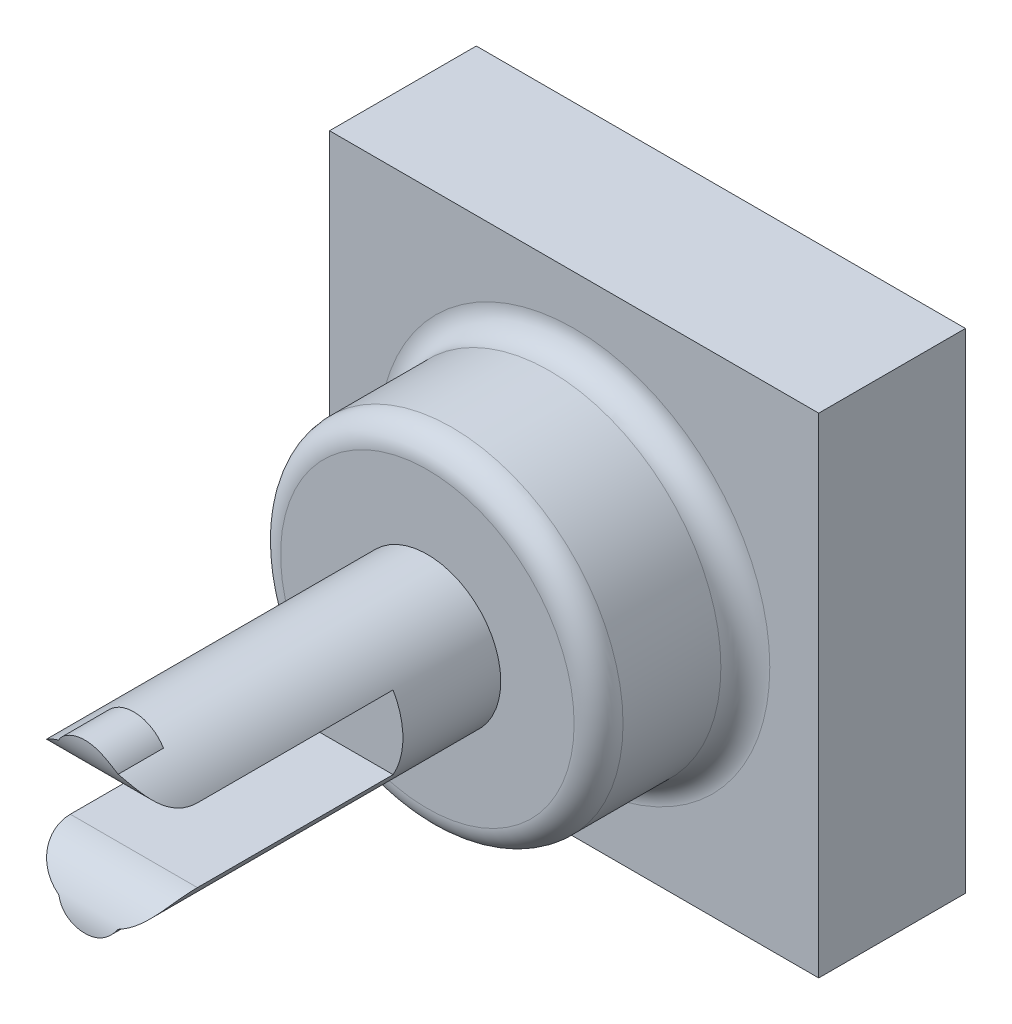
ISO-10303-21;
HEADER;
FILE_DESCRIPTION(('STEP AP214'),'2;1');
FILE_NAME('part.step','',(''),(''),'','','');
FILE_SCHEMA(('AUTOMOTIVE_DESIGN { 1 0 10303 214 1 1 1 1 }'));
ENDSEC;
DATA;
#1=APPLICATION_CONTEXT('core data for automotive mechanical design processes');
#2=APPLICATION_PROTOCOL_DEFINITION('international standard','automotive_design',2000,#1);
#3=PRODUCT_CONTEXT('',#1,'mechanical');
#4=PRODUCT('Part','Part','',(#3));
#5=PRODUCT_RELATED_PRODUCT_CATEGORY('part','',(#4));
#6=PRODUCT_DEFINITION_FORMATION('','',#4);
#7=PRODUCT_DEFINITION_CONTEXT('part definition',#1,'design');
#8=PRODUCT_DEFINITION('design','',#6,#7);
#9=PRODUCT_DEFINITION_SHAPE('','',#8);
#10=(LENGTH_UNIT() NAMED_UNIT(*) SI_UNIT(.MILLI.,.METRE.));
#11=(NAMED_UNIT(*) PLANE_ANGLE_UNIT() SI_UNIT($,.RADIAN.));
#12=(NAMED_UNIT(*) SI_UNIT($,.STERADIAN.) SOLID_ANGLE_UNIT());
#13=UNCERTAINTY_MEASURE_WITH_UNIT(LENGTH_MEASURE(1.E-05),#10,'distance_accuracy_value','');
#14=(GEOMETRIC_REPRESENTATION_CONTEXT(3) GLOBAL_UNCERTAINTY_ASSIGNED_CONTEXT((#13)) GLOBAL_UNIT_ASSIGNED_CONTEXT((#10,
#11,#12)) REPRESENTATION_CONTEXT('',''));
#15=CARTESIAN_POINT('',(0.,0.,0.));
#16=DIRECTION('',(0.,0.,1.));
#17=DIRECTION('',(1.,0.,0.));
#18=AXIS2_PLACEMENT_3D('',#15,#16,#17);
#19=CARTESIAN_POINT('',(5.,-5.,3.));
#20=DIRECTION('',(-1.,0.,0.));
#21=DIRECTION('',(0.,0.,1.));
#22=AXIS2_PLACEMENT_3D('',#19,#20,#21);
#23=PLANE('',#22);
#24=DIRECTION('',(0.,1.,0.));
#25=VECTOR('',#24,1.);
#26=CARTESIAN_POINT('',(5.,-5.,0.));
#27=LINE('',#26,#25);
#28=CARTESIAN_POINT('',(5.,-5.,0.));
#29=VERTEX_POINT('',#28);
#30=CARTESIAN_POINT('',(5.,5.,0.));
#31=VERTEX_POINT('',#30);
#32=EDGE_CURVE('E174',#29,#31,#27,.T.);
#33=ORIENTED_EDGE('',*,*,#32,.T.);
#34=DIRECTION('',(0.,0.,-1.));
#35=VECTOR('',#34,1.);
#36=CARTESIAN_POINT('',(5.,5.,3.));
#37=LINE('',#36,#35);
#38=CARTESIAN_POINT('',(5.,5.,3.));
#39=VERTEX_POINT('',#38);
#40=EDGE_CURVE('E201',#39,#31,#37,.T.);
#41=ORIENTED_EDGE('',*,*,#40,.F.);
#42=DIRECTION('',(0.,1.,0.));
#43=VECTOR('',#42,1.);
#44=CARTESIAN_POINT('',(5.,-5.,3.));
#45=LINE('',#44,#43);
#46=CARTESIAN_POINT('',(5.,-5.,3.));
#47=VERTEX_POINT('',#46);
#48=EDGE_CURVE('E175',#47,#39,#45,.T.);
#49=ORIENTED_EDGE('',*,*,#48,.F.);
#50=DIRECTION('',(0.,0.,-1.));
#51=VECTOR('',#50,1.);
#52=CARTESIAN_POINT('',(5.,-5.,3.));
#53=LINE('',#52,#51);
#54=EDGE_CURVE('E185',#47,#29,#53,.T.);
#55=ORIENTED_EDGE('',*,*,#54,.T.);
#56=EDGE_LOOP('',(#33,#41,#49,#55));
#57=FACE_BOUND('',#56,.T.);
#58=ADVANCED_FACE('F33',(#57),#23,.F.);
#59=CARTESIAN_POINT('',(-5.,5.,3.));
#60=DIRECTION('',(0.,-1.,0.));
#61=DIRECTION('',(0.,0.,-1.));
#62=AXIS2_PLACEMENT_3D('',#59,#60,#61);
#63=PLANE('',#62);
#64=DIRECTION('',(-1.,0.,0.));
#65=VECTOR('',#64,1.);
#66=CARTESIAN_POINT('',(-5.,5.,0.));
#67=LINE('',#66,#65);
#68=CARTESIAN_POINT('',(-5.,5.,0.));
#69=VERTEX_POINT('',#68);
#70=EDGE_CURVE('E188',#31,#69,#67,.T.);
#71=ORIENTED_EDGE('',*,*,#70,.T.);
#72=DIRECTION('',(0.,0.,-1.));
#73=VECTOR('',#72,1.);
#74=CARTESIAN_POINT('',(-5.,5.,3.));
#75=LINE('',#74,#73);
#76=CARTESIAN_POINT('',(-5.,5.,3.));
#77=VERTEX_POINT('',#76);
#78=EDGE_CURVE('E198',#77,#69,#75,.T.);
#79=ORIENTED_EDGE('',*,*,#78,.F.);
#80=DIRECTION('',(-1.,0.,0.));
#81=VECTOR('',#80,1.);
#82=CARTESIAN_POINT('',(-5.,5.,3.));
#83=LINE('',#82,#81);
#84=EDGE_CURVE('E178',#39,#77,#83,.T.);
#85=ORIENTED_EDGE('',*,*,#84,.F.);
#86=ORIENTED_EDGE('',*,*,#40,.T.);
#87=EDGE_LOOP('',(#71,#79,#85,#86));
#88=FACE_BOUND('',#87,.T.);
#89=ADVANCED_FACE('F279',(#88),#63,.F.);
#90=CARTESIAN_POINT('',(-5.,-5.,3.));
#91=DIRECTION('',(1.,0.,0.));
#92=DIRECTION('',(0.,0.,-1.));
#93=AXIS2_PLACEMENT_3D('',#90,#91,#92);
#94=PLANE('',#93);
#95=DIRECTION('',(0.,-1.,0.));
#96=VECTOR('',#95,1.);
#97=CARTESIAN_POINT('',(-5.,-5.,0.));
#98=LINE('',#97,#96);
#99=CARTESIAN_POINT('',(-5.,-5.,0.));
#100=VERTEX_POINT('',#99);
#101=EDGE_CURVE('E190',#69,#100,#98,.T.);
#102=ORIENTED_EDGE('',*,*,#101,.T.);
#103=DIRECTION('',(0.,0.,-1.));
#104=VECTOR('',#103,1.);
#105=CARTESIAN_POINT('',(-5.,-5.,3.));
#106=LINE('',#105,#104);
#107=CARTESIAN_POINT('',(-5.,-5.,3.));
#108=VERTEX_POINT('',#107);
#109=EDGE_CURVE('E195',#108,#100,#106,.T.);
#110=ORIENTED_EDGE('',*,*,#109,.F.);
#111=DIRECTION('',(0.,-1.,0.));
#112=VECTOR('',#111,1.);
#113=CARTESIAN_POINT('',(-5.,-5.,3.));
#114=LINE('',#113,#112);
#115=EDGE_CURVE('E181',#77,#108,#114,.T.);
#116=ORIENTED_EDGE('',*,*,#115,.F.);
#117=ORIENTED_EDGE('',*,*,#78,.T.);
#118=EDGE_LOOP('',(#102,#110,#116,#117));
#119=FACE_BOUND('',#118,.T.);
#120=ADVANCED_FACE('F284',(#119),#94,.F.);
#121=CARTESIAN_POINT('',(-5.,-5.,3.));
#122=DIRECTION('',(0.,1.,0.));
#123=DIRECTION('',(0.,0.,1.));
#124=AXIS2_PLACEMENT_3D('',#121,#122,#123);
#125=PLANE('',#124);
#126=DIRECTION('',(1.,0.,0.));
#127=VECTOR('',#126,1.);
#128=CARTESIAN_POINT('',(-5.,-5.,0.));
#129=LINE('',#128,#127);
#130=EDGE_CURVE('E179',#100,#29,#129,.T.);
#131=ORIENTED_EDGE('',*,*,#130,.T.);
#132=ORIENTED_EDGE('',*,*,#54,.F.);
#133=DIRECTION('',(1.,0.,0.));
#134=VECTOR('',#133,1.);
#135=CARTESIAN_POINT('',(-5.,-5.,3.));
#136=LINE('',#135,#134);
#137=EDGE_CURVE('E183',#108,#47,#136,.T.);
#138=ORIENTED_EDGE('',*,*,#137,.F.);
#139=ORIENTED_EDGE('',*,*,#109,.T.);
#140=EDGE_LOOP('',(#131,#132,#138,#139));
#141=FACE_BOUND('',#140,.T.);
#142=ADVANCED_FACE('F301',(#141),#125,.F.);
#143=CARTESIAN_POINT('',(0.,0.,3.));
#144=DIRECTION('',(0.,0.,-1.));
#145=DIRECTION('',(-1.,0.,0.));
#146=AXIS2_PLACEMENT_3D('',#143,#144,#145);
#147=PLANE('',#146);
#148=CARTESIAN_POINT('',(0.,0.,3.));
#149=DIRECTION('',(0.,0.,-1.));
#150=DIRECTION('',(-1.,0.,0.));
#151=AXIS2_PLACEMENT_3D('',#148,#149,#150);
#152=CIRCLE('',#151,4.);
#153=CARTESIAN_POINT('',(-4.,0.,3.));
#154=VERTEX_POINT('',#153);
#155=EDGE_CURVE('E41',#154,#154,#152,.T.);
#156=ORIENTED_EDGE('',*,*,#155,.T.);
#157=EDGE_LOOP('',(#156));
#158=FACE_BOUND('',#157,.T.);
#159=ORIENTED_EDGE('',*,*,#48,.T.);
#160=ORIENTED_EDGE('',*,*,#84,.T.);
#161=ORIENTED_EDGE('',*,*,#115,.T.);
#162=ORIENTED_EDGE('',*,*,#137,.T.);
#163=EDGE_LOOP('',(#159,#160,#161,#162));
#164=FACE_BOUND('',#163,.T.);
#165=ADVANCED_FACE('F297',(#158,#164),#147,.F.);
#166=CARTESIAN_POINT('',(0.,0.,0.));
#167=DIRECTION('',(0.,0.,-1.));
#168=DIRECTION('',(-1.,0.,0.));
#169=AXIS2_PLACEMENT_3D('',#166,#167,#168);
#170=PLANE('',#169);
#171=ORIENTED_EDGE('',*,*,#32,.F.);
#172=ORIENTED_EDGE('',*,*,#130,.F.);
#173=ORIENTED_EDGE('',*,*,#101,.F.);
#174=ORIENTED_EDGE('',*,*,#70,.F.);
#175=EDGE_LOOP('',(#171,#172,#173,#174));
#176=FACE_BOUND('',#175,.T.);
#177=ADVANCED_FACE('F292',(#176),#170,.T.);
#178=CARTESIAN_POINT('',(0.,0.,6.));
#179=DIRECTION('',(0.,0.,-1.));
#180=DIRECTION('',(-1.,0.,0.));
#181=AXIS2_PLACEMENT_3D('',#178,#179,#180);
#182=CYLINDRICAL_SURFACE('',#181,3.5);
#183=CARTESIAN_POINT('',(0.,0.,3.5));
#184=DIRECTION('',(0.,0.,-1.));
#185=DIRECTION('',(-1.,0.,0.));
#186=AXIS2_PLACEMENT_3D('',#183,#184,#185);
#187=CIRCLE('',#186,3.5);
#188=CARTESIAN_POINT('',(-3.5,0.,3.5));
#189=VERTEX_POINT('',#188);
#190=EDGE_CURVE('E324',#189,#189,#187,.F.);
#191=ORIENTED_EDGE('',*,*,#190,.T.);
#192=EDGE_LOOP('',(#191));
#193=FACE_BOUND('',#192,.T.);
#194=CARTESIAN_POINT('',(0.,0.,5.5));
#195=DIRECTION('',(0.,0.,1.));
#196=DIRECTION('',(1.,0.,0.));
#197=AXIS2_PLACEMENT_3D('',#194,#195,#196);
#198=CIRCLE('',#197,3.5);
#199=CARTESIAN_POINT('',(3.5,0.,5.5));
#200=VERTEX_POINT('',#199);
#201=EDGE_CURVE('E327',#200,#200,#198,.F.);
#202=ORIENTED_EDGE('',*,*,#201,.T.);
#203=EDGE_LOOP('',(#202));
#204=FACE_BOUND('',#203,.T.);
#205=ADVANCED_FACE('F312',(#193,#204),#182,.T.);
#206=CARTESIAN_POINT('',(0.,0.,6.));
#207=DIRECTION('',(0.,0.,1.));
#208=DIRECTION('',(1.,0.,0.));
#209=AXIS2_PLACEMENT_3D('',#206,#207,#208);
#210=PLANE('',#209);
#211=CARTESIAN_POINT('',(0.,0.,6.));
#212=DIRECTION('',(0.,0.,1.));
#213=DIRECTION('',(1.,0.,0.));
#214=AXIS2_PLACEMENT_3D('',#211,#212,#213);
#215=CIRCLE('',#214,3.);
#216=CARTESIAN_POINT('',(3.,0.,6.));
#217=VERTEX_POINT('',#216);
#218=EDGE_CURVE('E11',#217,#217,#215,.T.);
#219=ORIENTED_EDGE('',*,*,#218,.T.);
#220=EDGE_LOOP('',(#219));
#221=FACE_BOUND('',#220,.T.);
#222=CARTESIAN_POINT('',(0.,0.,6.));
#223=DIRECTION('',(0.,0.,1.));
#224=DIRECTION('',(1.,0.,0.));
#225=AXIS2_PLACEMENT_3D('',#222,#223,#224);
#226=CIRCLE('',#225,1.5);
#227=CARTESIAN_POINT('',(1.5,0.,6.));
#228=VERTEX_POINT('',#227);
#229=EDGE_CURVE('E171',#228,#228,#226,.T.);
#230=ORIENTED_EDGE('',*,*,#229,.F.);
#231=EDGE_LOOP('',(#230));
#232=FACE_BOUND('',#231,.T.);
#233=ADVANCED_FACE('F228',(#221,#232),#210,.T.);
#234=CARTESIAN_POINT('',(0.,0.,13.));
#235=DIRECTION('',(0.,0.,-1.));
#236=DIRECTION('',(-1.,0.,0.));
#237=AXIS2_PLACEMENT_3D('',#234,#235,#236);
#238=CYLINDRICAL_SURFACE('',#237,1.5);
#239=DIRECTION('',(0.,0.,-1.));
#240=VECTOR('',#239,1.);
#241=CARTESIAN_POINT('',(-1.29903810567666,0.75,13.));
#242=LINE('',#241,#240);
#243=CARTESIAN_POINT('',(-1.29903810567666,0.75,8.));
#244=VERTEX_POINT('',#243);
#245=CARTESIAN_POINT('',(-1.29903810567666,0.75,12.));
#246=VERTEX_POINT('',#245);
#247=EDGE_CURVE('E135',#244,#246,#242,.F.);
#248=ORIENTED_EDGE('',*,*,#247,.T.);
#249=CARTESIAN_POINT('',(-1.29903810567666,0.75,12.));
#250=CARTESIAN_POINT('',(-1.29903488796064,0.749998995664194,12.0241539240563));
#251=CARTESIAN_POINT('',(-1.29853286453121,0.750875868741205,12.0482965166914));
#252=CARTESIAN_POINT('',(-1.29650975747627,0.754366235091708,12.096413316051));
#253=CARTESIAN_POINT('',(-1.29498865171252,0.756979766091814,12.120387519106));
#254=CARTESIAN_POINT('',(-1.28886921008611,0.767388689671477,12.191783216743));
#255=CARTESIAN_POINT('',(-1.28271483737892,0.777752502095519,12.2387333870776));
#256=CARTESIAN_POINT('',(-1.26591452387574,0.804805039707058,12.3299619855437));
#257=CARTESIAN_POINT('',(-1.25526409092647,0.821500088928881,12.3742376908215));
#258=CARTESIAN_POINT('',(-1.22903712147644,0.860239334987382,12.4587860070871));
#259=CARTESIAN_POINT('',(-1.21346378030899,0.882280059929423,12.4990611924868));
#260=CARTESIAN_POINT('',(-1.17723309549798,0.930057831614213,12.5741567709373));
#261=CARTESIAN_POINT('',(-1.15663021002548,0.955754129407387,12.6090294523836));
#262=CARTESIAN_POINT('',(-1.11019990741427,1.0093110654543,12.6731464884562));
#263=CARTESIAN_POINT('',(-1.08437361289219,1.03717123785629,12.7023920498339));
#264=CARTESIAN_POINT('',(-1.02721530563586,1.09383621555043,12.7556409037523));
#265=CARTESIAN_POINT('',(-0.995784523058708,1.12264880644261,12.7795291029872));
#266=CARTESIAN_POINT('',(-0.928330513402187,1.17904216758258,12.8217377372788));
#267=CARTESIAN_POINT('',(-0.892298830568609,1.20662054021775,12.8400477051537));
#268=CARTESIAN_POINT('',(-0.816134552710509,1.25939963396201,12.8719352989423));
#269=CARTESIAN_POINT('',(-0.775972007599837,1.28458000831826,12.8854746784931));
#270=CARTESIAN_POINT('',(-0.713532454978741,1.31963687422097,12.9027492045215));
#271=CARTESIAN_POINT('',(-0.692393064696444,1.33085256723746,12.9079949363484));
#272=CARTESIAN_POINT('',(-0.649450607751044,1.35232755324812,12.9176023046443));
#273=CARTESIAN_POINT('',(-0.627647857194764,1.36258729259364,12.9219643548481));
#274=CARTESIAN_POINT('',(-0.605547236868077,1.37233834892181,12.9259436685376));
#275=B_SPLINE_CURVE_WITH_KNOTS('',3,(#249,#250,#251,#252,#253,#254,#255,#256,#257,#258,#259,
#260,#261,#262,#263,#264,#265,#266,#267,#268,#269,#270,#271,#272,#273,#274),.UNSPECIFIED.,.F.,
.F.,(4,2,2,2,2,2,2,2,2,2,2,2,4),(0.,0.0724179988227322,0.144837570882908,0.289512045608847,
0.434331412489504,0.579056973181818,0.722280060806996,0.865472399531166,1.01149616411106,
1.15779226851151,1.30523589888323,1.37869546547415,1.45212055881189),.UNSPECIFIED.);
#276=CARTESIAN_POINT('',(-0.605547236868077,1.37233834892181,12.9259436685376));
#277=VERTEX_POINT('',#276);
#278=EDGE_CURVE('E240',#246,#277,#275,.T.);
#279=ORIENTED_EDGE('',*,*,#278,.T.);
#280=DIRECTION('',(0.,0.,1.));
#281=VECTOR('',#280,1.);
#282=CARTESIAN_POINT('',(-0.605547236868077,1.37233834892181,12.5));
#283=LINE('',#282,#281);
#284=CARTESIAN_POINT('',(-0.605547236868077,1.37233834892181,12.));
#285=VERTEX_POINT('',#284);
#286=EDGE_CURVE('E163',#277,#285,#283,.F.);
#287=ORIENTED_EDGE('',*,*,#286,.T.);
#288=CARTESIAN_POINT('',(0.,0.,12.));
#289=DIRECTION('',(0.,0.,1.));
#290=DIRECTION('',(1.,0.,0.));
#291=AXIS2_PLACEMENT_3D('',#288,#289,#290);
#292=CIRCLE('',#291,1.5);
#293=CARTESIAN_POINT('',(0.605547236868076,1.37233834892181,12.));
#294=VERTEX_POINT('',#293);
#295=EDGE_CURVE('E147',#294,#285,#292,.T.);
#296=ORIENTED_EDGE('',*,*,#295,.F.);
#297=DIRECTION('',(0.,0.,1.));
#298=VECTOR('',#297,1.);
#299=CARTESIAN_POINT('',(0.605547236868076,1.37233834892181,12.5));
#300=LINE('',#299,#298);
#301=CARTESIAN_POINT('',(0.605547236868076,1.37233834892181,12.9259436685376));
#302=VERTEX_POINT('',#301);
#303=EDGE_CURVE('E165',#294,#302,#300,.T.);
#304=ORIENTED_EDGE('',*,*,#303,.T.);
#305=CARTESIAN_POINT('',(0.605547236868076,1.37233834892181,12.9259436685376));
#306=CARTESIAN_POINT('',(0.633444536608088,1.36003546599838,12.920919974879));
#307=CARTESIAN_POINT('',(0.660877544308602,1.34690774268419,12.915284895509));
#308=CARTESIAN_POINT('',(0.714665217233725,1.31915341585041,12.9025561360737));
#309=CARTESIAN_POINT('',(0.741018569848264,1.30452505940383,12.8954607402174));
#310=CARTESIAN_POINT('',(0.792558527572501,1.27387392290518,12.8795467414734));
#311=CARTESIAN_POINT('',(0.817738661366562,1.25784455500115,12.8707197244983));
#312=CARTESIAN_POINT('',(0.866574396979076,1.22471249771493,12.8511425956986));
#313=CARTESIAN_POINT('',(0.890230780017801,1.20761036735539,12.8403934801737));
#314=CARTESIAN_POINT('',(0.951346758060412,1.16071481409496,12.8087020458392));
#315=CARTESIAN_POINT('',(0.987271390455002,1.13018923586816,12.7857945127178));
#316=CARTESIAN_POINT('',(1.05333911710569,1.06888073734977,12.733277936692));
#317=CARTESIAN_POINT('',(1.08349956520143,1.03809889025173,12.703689613326));
#318=CARTESIAN_POINT('',(1.13781513938899,0.978274354353152,12.6375231470258));
#319=CARTESIAN_POINT('',(1.161937213682,0.949241870736925,12.6009083921194));
#320=CARTESIAN_POINT('',(1.20394492657772,0.895372374367405,12.5214542939207));
#321=CARTESIAN_POINT('',(1.22182466740295,0.870539340626403,12.47860911794));
#322=CARTESIAN_POINT('',(1.25049386853993,0.828767925137302,12.3917479546897));
#323=CARTESIAN_POINT('',(1.26174143406937,0.811351989800523,12.3481100462022));
#324=CARTESIAN_POINT('',(1.27971488700054,0.782699378080705,12.2579921061235));
#325=CARTESIAN_POINT('',(1.28644475845063,0.771457258750419,12.2115146182653));
#326=CARTESIAN_POINT('',(1.29376421420455,0.759078371123018,12.1372278222096));
#327=CARTESIAN_POINT('',(1.29574833937092,0.755676783241795,12.1099050042401));
#328=CARTESIAN_POINT('',(1.29838137672572,0.751138079889695,12.0550586577361));
#329=CARTESIAN_POINT('',(1.29903273513632,0.749996815838874,12.0275355901394));
#330=CARTESIAN_POINT('',(1.29903810567666,0.750000000000001,12.));
#331=B_SPLINE_CURVE_WITH_KNOTS('',3,(#305,#306,#307,#308,#309,#310,#311,#312,#313,#314,#315,
#316,#317,#318,#319,#320,#321,#322,#323,#324,#325,#326,#327,#328,#329,#330),.UNSPECIFIED.,.F.,
.F.,(4,2,2,2,2,2,2,2,2,2,2,2,4),(0.,0.0926947401636657,0.185499019721168,0.278765941114954,
0.371984657974164,0.528502857110953,0.684542146669887,0.841417727311398,0.998441125954954,
1.14270434142997,1.28684016684037,1.36954256393352,1.45209302853291),.UNSPECIFIED.);
#332=CARTESIAN_POINT('',(1.29903810567666,0.750000000000001,12.));
#333=VERTEX_POINT('',#332);
#334=EDGE_CURVE('E129',#302,#333,#331,.T.);
#335=ORIENTED_EDGE('',*,*,#334,.T.);
#336=DIRECTION('',(0.,0.,-1.));
#337=VECTOR('',#336,1.);
#338=CARTESIAN_POINT('',(1.29903810567666,0.750000000000001,13.));
#339=LINE('',#338,#337);
#340=CARTESIAN_POINT('',(1.29903810567666,0.750000000000001,8.));
#341=VERTEX_POINT('',#340);
#342=EDGE_CURVE('E121',#333,#341,#339,.T.);
#343=ORIENTED_EDGE('',*,*,#342,.T.);
#344=CARTESIAN_POINT('',(0.,0.,8.));
#345=DIRECTION('',(0.,0.,1.));
#346=DIRECTION('',(1.,0.,0.));
#347=AXIS2_PLACEMENT_3D('',#344,#345,#346);
#348=CIRCLE('',#347,1.5);
#349=CARTESIAN_POINT('',(1.29903810567666,-0.749999999999999,8.));
#350=VERTEX_POINT('',#349);
#351=EDGE_CURVE('E126',#350,#341,#348,.T.);
#352=ORIENTED_EDGE('',*,*,#351,.F.);
#353=DIRECTION('',(0.,0.,-1.));
#354=VECTOR('',#353,1.);
#355=CARTESIAN_POINT('',(1.29903810567666,-0.749999999999999,13.));
#356=LINE('',#355,#354);
#357=CARTESIAN_POINT('',(1.29903810567666,-0.749999999999999,12.));
#358=VERTEX_POINT('',#357);
#359=EDGE_CURVE('E134',#350,#358,#356,.F.);
#360=ORIENTED_EDGE('',*,*,#359,.T.);
#361=CARTESIAN_POINT('',(1.29903810567666,-0.749999999999999,12.));
#362=CARTESIAN_POINT('',(1.29903488796064,-0.749998995664194,12.0241539240563));
#363=CARTESIAN_POINT('',(1.29853286453121,-0.750875868741205,12.0482965166914));
#364=CARTESIAN_POINT('',(1.29650975747627,-0.754366235091707,12.096413316051));
#365=CARTESIAN_POINT('',(1.29498865171252,-0.756979766091814,12.120387519106));
#366=CARTESIAN_POINT('',(1.28886921008611,-0.767388689671477,12.191783216743));
#367=CARTESIAN_POINT('',(1.28271483737892,-0.777752502095518,12.2387333870776));
#368=CARTESIAN_POINT('',(1.26591452387574,-0.804805039707057,12.3299619855437));
#369=CARTESIAN_POINT('',(1.25526409092647,-0.821500088928881,12.3742376908215));
#370=CARTESIAN_POINT('',(1.22903712147644,-0.860239334987382,12.4587860070871));
#371=CARTESIAN_POINT('',(1.21346378030899,-0.882280059929423,12.4990611924868));
#372=CARTESIAN_POINT('',(1.17723309549798,-0.930057831614213,12.5741567709373));
#373=CARTESIAN_POINT('',(1.15663021002548,-0.955754129407387,12.6090294523836));
#374=CARTESIAN_POINT('',(1.11019990741427,-1.0093110654543,12.6731464884562));
#375=CARTESIAN_POINT('',(1.08437361289219,-1.03717123785629,12.7023920498339));
#376=CARTESIAN_POINT('',(1.02721530563586,-1.09383621555043,12.7556409037523));
#377=CARTESIAN_POINT('',(0.995784523058709,-1.12264880644261,12.7795291029872));
#378=CARTESIAN_POINT('',(0.928330513402188,-1.17904216758258,12.8217377372788));
#379=CARTESIAN_POINT('',(0.89229883056861,-1.20662054021775,12.8400477051537));
#380=CARTESIAN_POINT('',(0.816134552710509,-1.25939963396201,12.8719352989423));
#381=CARTESIAN_POINT('',(0.775972007599837,-1.28458000831826,12.8854746784931));
#382=CARTESIAN_POINT('',(0.71353245497874,-1.31963687422097,12.9027492045215));
#383=CARTESIAN_POINT('',(0.692393064696443,-1.33085256723746,12.9079949363484));
#384=CARTESIAN_POINT('',(0.649450607751043,-1.35232755324812,12.9176023046443));
#385=CARTESIAN_POINT('',(0.627647857194762,-1.36258729259364,12.9219643548481));
#386=CARTESIAN_POINT('',(0.605547236868076,-1.37233834892181,12.9259436685376));
#387=B_SPLINE_CURVE_WITH_KNOTS('',3,(#361,#362,#363,#364,#365,#366,#367,#368,#369,#370,#371,
#372,#373,#374,#375,#376,#377,#378,#379,#380,#381,#382,#383,#384,#385,#386),.UNSPECIFIED.,.F.,
.F.,(4,2,2,2,2,2,2,2,2,2,2,2,4),(0.,0.0724179988227322,0.144837570882908,0.289512045608847,
0.434331412489504,0.579056973181818,0.722280060806999,0.865472399531166,1.01149616411106,
1.15779226851151,1.30523589888323,1.37869546547415,1.45212055881189),.UNSPECIFIED.);
#388=CARTESIAN_POINT('',(0.605547236868077,-1.37233834892181,12.9259436685376));
#389=VERTEX_POINT('',#388);
#390=EDGE_CURVE('E56',#358,#389,#387,.T.);
#391=ORIENTED_EDGE('',*,*,#390,.T.);
#392=DIRECTION('',(0.,0.,1.));
#393=VECTOR('',#392,1.);
#394=CARTESIAN_POINT('',(0.605547236868077,-1.37233834892181,12.5));
#395=LINE('',#394,#393);
#396=CARTESIAN_POINT('',(0.605547236868077,-1.37233834892181,12.));
#397=VERTEX_POINT('',#396);
#398=EDGE_CURVE('E167',#389,#397,#395,.F.);
#399=ORIENTED_EDGE('',*,*,#398,.T.);
#400=CARTESIAN_POINT('',(-0.605547236868077,-1.37233834892181,12.));
#401=VERTEX_POINT('',#400);
#402=EDGE_CURVE('E204',#401,#397,#292,.T.);
#403=ORIENTED_EDGE('',*,*,#402,.F.);
#404=DIRECTION('',(0.,0.,1.));
#405=VECTOR('',#404,1.);
#406=CARTESIAN_POINT('',(-0.605547236868077,-1.37233834892181,12.5));
#407=LINE('',#406,#405);
#408=CARTESIAN_POINT('',(-0.605547236868077,-1.37233834892181,12.9259436685376));
#409=VERTEX_POINT('',#408);
#410=EDGE_CURVE('E169',#401,#409,#407,.T.);
#411=ORIENTED_EDGE('',*,*,#410,.T.);
#412=CARTESIAN_POINT('',(-0.605547236868077,-1.37233834892181,12.9259436685376));
#413=CARTESIAN_POINT('',(-0.633444536608089,-1.36003546599838,12.920919974879));
#414=CARTESIAN_POINT('',(-0.660877544308604,-1.34690774268419,12.915284895509));
#415=CARTESIAN_POINT('',(-0.714665217233726,-1.3191534158504,12.9025561360737));
#416=CARTESIAN_POINT('',(-0.741018569848265,-1.30452505940383,12.8954607402174));
#417=CARTESIAN_POINT('',(-0.792558527572501,-1.27387392290517,12.8795467414734));
#418=CARTESIAN_POINT('',(-0.817738661366562,-1.25784455500115,12.8707197244983));
#419=CARTESIAN_POINT('',(-0.866574396979077,-1.22471249771493,12.8511425956986));
#420=CARTESIAN_POINT('',(-0.890230780017802,-1.20761036735539,12.8403934801737));
#421=CARTESIAN_POINT('',(-0.951346758060412,-1.16071481409496,12.8087020458392));
#422=CARTESIAN_POINT('',(-0.987271390455002,-1.13018923586816,12.7857945127178));
#423=CARTESIAN_POINT('',(-1.05333911710569,-1.06888073734977,12.733277936692));
#424=CARTESIAN_POINT('',(-1.08349956520143,-1.03809889025173,12.703689613326));
#425=CARTESIAN_POINT('',(-1.13781513938899,-0.978274354353152,12.6375231470258));
#426=CARTESIAN_POINT('',(-1.161937213682,-0.949241870736924,12.6009083921194));
#427=CARTESIAN_POINT('',(-1.20394492657772,-0.895372374367404,12.5214542939207));
#428=CARTESIAN_POINT('',(-1.22182466740295,-0.870539340626401,12.47860911794));
#429=CARTESIAN_POINT('',(-1.25049386853994,-0.828767925137301,12.3917479546897));
#430=CARTESIAN_POINT('',(-1.26174143406937,-0.811351989800521,12.3481100462022));
#431=CARTESIAN_POINT('',(-1.27971488700054,-0.782699378080704,12.2579921061235));
#432=CARTESIAN_POINT('',(-1.28644475845063,-0.771457258750418,12.2115146182652));
#433=CARTESIAN_POINT('',(-1.29376421420455,-0.759078371123018,12.1372278222096));
#434=CARTESIAN_POINT('',(-1.29574833937092,-0.755676783241795,12.1099050042401));
#435=CARTESIAN_POINT('',(-1.29838137672572,-0.751138079889695,12.0550586577361));
#436=CARTESIAN_POINT('',(-1.29903273513632,-0.749996815838874,12.0275355901394));
#437=CARTESIAN_POINT('',(-1.29903810567666,-0.75,12.));
#438=B_SPLINE_CURVE_WITH_KNOTS('',3,(#412,#413,#414,#415,#416,#417,#418,#419,#420,#421,#422,
#423,#424,#425,#426,#427,#428,#429,#430,#431,#432,#433,#434,#435,#436,#437),.UNSPECIFIED.,.F.,
.F.,(4,2,2,2,2,2,2,2,2,2,2,2,4),(0.,0.0926947401636657,0.185499019721168,0.278765941114953,
0.371984657974164,0.528502857110953,0.684542146669887,0.841417727311399,0.998441125954955,
1.14270434142997,1.28684016684037,1.36954256393352,1.45209302853291),.UNSPECIFIED.);
#439=CARTESIAN_POINT('',(-1.29903810567666,-0.75,12.));
#440=VERTEX_POINT('',#439);
#441=EDGE_CURVE('E209',#409,#440,#438,.T.);
#442=ORIENTED_EDGE('',*,*,#441,.T.);
#443=DIRECTION('',(0.,0.,-1.));
#444=VECTOR('',#443,1.);
#445=CARTESIAN_POINT('',(-1.29903810567666,-0.75,13.));
#446=LINE('',#445,#444);
#447=CARTESIAN_POINT('',(-1.29903810567666,-0.75,8.));
#448=VERTEX_POINT('',#447);
#449=EDGE_CURVE('E155',#440,#448,#446,.T.);
#450=ORIENTED_EDGE('',*,*,#449,.T.);
#451=EDGE_CURVE('E146',#244,#448,#348,.T.);
#452=ORIENTED_EDGE('',*,*,#451,.F.);
#453=EDGE_LOOP('',(#248,#279,#287,#296,#304,#335,#343,#352,#360,#391,#399,#403,#411,#442,#450,#452));
#454=FACE_BOUND('',#453,.T.);
#455=ORIENTED_EDGE('',*,*,#229,.T.);
#456=EDGE_LOOP('',(#455));
#457=FACE_BOUND('',#456,.T.);
#458=ADVANCED_FACE('F124',(#454,#457),#238,.T.);
#459=CARTESIAN_POINT('',(0.,-1.,12.));
#460=DIRECTION('',(0.,0.,1.));
#461=DIRECTION('',(1.,0.,0.));
#462=AXIS2_PLACEMENT_3D('',#459,#460,#461);
#463=PLANE('',#462);
#464=CARTESIAN_POINT('',(0.,-1.,12.));
#465=DIRECTION('',(0.,0.,1.));
#466=DIRECTION('',(1.,0.,0.));
#467=AXIS2_PLACEMENT_3D('',#464,#465,#466);
#468=CIRCLE('',#467,0.71086095838524);
#469=EDGE_CURVE('E157',#401,#397,#468,.T.);
#470=ORIENTED_EDGE('',*,*,#469,.F.);
#471=ORIENTED_EDGE('',*,*,#402,.T.);
#472=EDGE_LOOP('',(#470,#471));
#473=FACE_BOUND('',#472,.T.);
#474=ADVANCED_FACE('F227',(#473),#463,.F.);
#475=CARTESIAN_POINT('',(0.,-1.,12.));
#476=DIRECTION('',(0.,0.,1.));
#477=DIRECTION('',(1.,0.,0.));
#478=AXIS2_PLACEMENT_3D('',#475,#476,#477);
#479=CYLINDRICAL_SURFACE('',#478,0.71086095838524);
#480=ORIENTED_EDGE('',*,*,#398,.F.);
#481=CARTESIAN_POINT('',(0.605547236868077,-1.37233834892181,12.9259436685376));
#482=CARTESIAN_POINT('',(0.596477187977453,-1.38709376993395,12.9319638266935));
#483=CARTESIAN_POINT('',(0.586778704161586,-1.40165239844594,12.937488319546));
#484=CARTESIAN_POINT('',(0.566170431236198,-1.43021387702408,12.9476104386842));
#485=CARTESIAN_POINT('',(0.555261187549505,-1.44421697351801,12.9522084797105));
#486=CARTESIAN_POINT('',(0.520898722378295,-1.48501973725054,12.9646711532018));
#487=CARTESIAN_POINT('',(0.49571027360368,-1.51077814976189,12.9712688709568));
#488=CARTESIAN_POINT('',(0.441445703859872,-1.55834853926269,12.981766762032));
#489=CARTESIAN_POINT('',(0.412373287687338,-1.58016423100249,12.985669484407));
#490=CARTESIAN_POINT('',(0.351064914705663,-1.6191919802229,12.9916047288733));
#491=CARTESIAN_POINT('',(0.318824646691619,-1.63639764180477,12.9936346621165));
#492=CARTESIAN_POINT('',(0.250597030848229,-1.66631291071759,12.996610895199));
#493=CARTESIAN_POINT('',(0.214507662478318,-1.67879419622731,12.9975061767222));
#494=CARTESIAN_POINT('',(0.140845592436538,-1.69780207239648,12.998683071257));
#495=CARTESIAN_POINT('',(0.103275980933032,-1.70434044683871,12.9989659002051));
#496=CARTESIAN_POINT('',(0.0436988781126455,-1.7098547282023,12.9991943342456));
#497=CARTESIAN_POINT('',(0.0218557116995794,-1.71086273408377,12.9992321273449));
#498=CARTESIAN_POINT('',(-0.0395802748871391,-1.71085774262925,12.9992367565098));
#499=CARTESIAN_POINT('',(-0.0792016939427898,-1.70754279513696,12.9991211916418));
#500=CARTESIAN_POINT('',(-0.157408163062817,-1.69435199561041,12.9984711986093));
#501=CARTESIAN_POINT('',(-0.19599058238244,-1.68446086981762,12.9979357948111));
#502=CARTESIAN_POINT('',(-0.270954535967149,-1.65839260878145,12.9958808895368));
#503=CARTESIAN_POINT('',(-0.307335965347915,-1.64221517424731,12.9943613412035));
#504=CARTESIAN_POINT('',(-0.376792414608964,-1.60408397572876,12.9894823729147));
#505=CARTESIAN_POINT('',(-0.40986936465611,-1.58213361129199,12.986124034526));
#506=CARTESIAN_POINT('',(-0.468619540301044,-1.53570590123047,12.9770263681389));
#507=CARTESIAN_POINT('',(-0.494701356337743,-1.51169233934221,12.9715549979672));
#508=CARTESIAN_POINT('',(-0.542599158699663,-1.46057351057186,12.957563116151));
#509=CARTESIAN_POINT('',(-0.564425153429967,-1.43347574065481,12.9490498950304));
#510=CARTESIAN_POINT('',(-0.591477135416826,-1.39453633142631,12.9347640202595));
#511=CARTESIAN_POINT('',(-0.598697493462974,-1.38348959621039,12.9304951442292));
#512=CARTESIAN_POINT('',(-0.60554723686808,-1.37233834892181,12.9259436685376));
#513=B_SPLINE_CURVE_WITH_KNOTS('',3,(#481,#482,#483,#484,#485,#486,#487,#488,#489,#490,#491,
#492,#493,#494,#495,#496,#497,#498,#499,#500,#501,#502,#503,#504,#505,#506,#507,#508,#509,#510,
#511,#512),.UNSPECIFIED.,.F.,.F.,(4,2,2,2,2,2,2,2,2,2,2,2,2,2,2,4),(0.,0.0549720554726529,
0.109919446897594,0.219211063769027,0.32839916532004,0.437737977767939,0.551836422626281,
0.665708132961674,0.731238572903746,0.849912943339931,0.968863912947969,1.08782054649833,
1.20670728542465,1.31385059826313,1.42073882029565,1.46231694204286),.UNSPECIFIED.);
#514=EDGE_CURVE('E48',#389,#409,#513,.T.);
#515=ORIENTED_EDGE('',*,*,#514,.T.);
#516=ORIENTED_EDGE('',*,*,#410,.F.);
#517=ORIENTED_EDGE('',*,*,#469,.T.);
#518=EDGE_LOOP('',(#480,#515,#516,#517));
#519=FACE_BOUND('',#518,.T.);
#520=ADVANCED_FACE('F229',(#519),#479,.T.);
#521=CARTESIAN_POINT('',(0.,1.,12.));
#522=DIRECTION('',(0.,0.,1.));
#523=DIRECTION('',(1.,0.,0.));
#524=AXIS2_PLACEMENT_3D('',#521,#522,#523);
#525=CIRCLE('',#524,0.71086095838524);
#526=EDGE_CURVE('E160',#294,#285,#525,.T.);
#527=ORIENTED_EDGE('',*,*,#526,.F.);
#528=ORIENTED_EDGE('',*,*,#295,.T.);
#529=EDGE_LOOP('',(#527,#528));
#530=FACE_BOUND('',#529,.T.);
#531=ADVANCED_FACE('F264',(#530),#463,.F.);
#532=CARTESIAN_POINT('',(0.,1.,12.));
#533=DIRECTION('',(0.,0.,1.));
#534=DIRECTION('',(1.,0.,0.));
#535=AXIS2_PLACEMENT_3D('',#532,#533,#534);
#536=CYLINDRICAL_SURFACE('',#535,0.71086095838524);
#537=ORIENTED_EDGE('',*,*,#286,.F.);
#538=CARTESIAN_POINT('',(-0.605547236868077,1.37233834892181,12.9259436685376));
#539=CARTESIAN_POINT('',(-0.596477187977454,1.38709376993395,12.9319638266935));
#540=CARTESIAN_POINT('',(-0.586778704161587,1.40165239844594,12.937488319546));
#541=CARTESIAN_POINT('',(-0.566170431236198,1.43021387702408,12.9476104386842));
#542=CARTESIAN_POINT('',(-0.555261187549505,1.44421697351801,12.9522084797105));
#543=CARTESIAN_POINT('',(-0.520898722378295,1.48501973725054,12.9646711532018));
#544=CARTESIAN_POINT('',(-0.49571027360368,1.51077814976189,12.9712688709568));
#545=CARTESIAN_POINT('',(-0.441445703859872,1.55834853926269,12.981766762032));
#546=CARTESIAN_POINT('',(-0.412373287687338,1.58016423100249,12.985669484407));
#547=CARTESIAN_POINT('',(-0.351064914705663,1.6191919802229,12.9916047288733));
#548=CARTESIAN_POINT('',(-0.31882464669162,1.63639764180477,12.9936346621165));
#549=CARTESIAN_POINT('',(-0.25059703084823,1.66631291071759,12.996610895199));
#550=CARTESIAN_POINT('',(-0.214507662478319,1.67879419622731,12.9975061767222));
#551=CARTESIAN_POINT('',(-0.140845592436538,1.69780207239648,12.998683071257));
#552=CARTESIAN_POINT('',(-0.103275980933032,1.70434044683871,12.9989659002051));
#553=CARTESIAN_POINT('',(-0.043698878112646,1.7098547282023,12.9991943342456));
#554=CARTESIAN_POINT('',(-0.0218557116995801,1.71086273408377,12.9992321273449));
#555=CARTESIAN_POINT('',(0.039580274887138,1.71085774262925,12.9992367565098));
#556=CARTESIAN_POINT('',(0.0792016939427888,1.70754279513696,12.9991211916418));
#557=CARTESIAN_POINT('',(0.157408163062816,1.69435199561041,12.9984711986093));
#558=CARTESIAN_POINT('',(0.195990582382439,1.68446086981762,12.9979357948111));
#559=CARTESIAN_POINT('',(0.270954535967148,1.65839260878145,12.9958808895368));
#560=CARTESIAN_POINT('',(0.307335965347914,1.64221517424731,12.9943613412035));
#561=CARTESIAN_POINT('',(0.376792414608963,1.60408397572876,12.9894823729147));
#562=CARTESIAN_POINT('',(0.409869364656109,1.58213361129199,12.986124034526));
#563=CARTESIAN_POINT('',(0.468619540301042,1.53570590123048,12.9770263681389));
#564=CARTESIAN_POINT('',(0.494701356337742,1.51169233934221,12.9715549979672));
#565=CARTESIAN_POINT('',(0.542599158699662,1.46057351057186,12.957563116151));
#566=CARTESIAN_POINT('',(0.564425153429966,1.43347574065481,12.9490498950304));
#567=CARTESIAN_POINT('',(0.591477135416825,1.39453633142631,12.9347640202595));
#568=CARTESIAN_POINT('',(0.598697493462973,1.38348959621039,12.9304951442292));
#569=CARTESIAN_POINT('',(0.605547236868079,1.37233834892181,12.9259436685376));
#570=B_SPLINE_CURVE_WITH_KNOTS('',3,(#538,#539,#540,#541,#542,#543,#544,#545,#546,#547,#548,
#549,#550,#551,#552,#553,#554,#555,#556,#557,#558,#559,#560,#561,#562,#563,#564,#565,#566,#567,
#568,#569),.UNSPECIFIED.,.F.,.F.,(4,2,2,2,2,2,2,2,2,2,2,2,2,2,2,4),(0.,0.054972055472653,
0.109919446897594,0.219211063769028,0.32839916532004,0.437737977767939,0.551836422626281,
0.665708132961674,0.731238572903746,0.84991294333993,0.968863912947968,1.08782054649833,
1.20670728542465,1.31385059826313,1.42073882029564,1.46231694204286),.UNSPECIFIED.);
#571=EDGE_CURVE('E253',#277,#302,#570,.T.);
#572=ORIENTED_EDGE('',*,*,#571,.T.);
#573=ORIENTED_EDGE('',*,*,#303,.F.);
#574=ORIENTED_EDGE('',*,*,#526,.T.);
#575=EDGE_LOOP('',(#537,#572,#573,#574));
#576=FACE_BOUND('',#575,.T.);
#577=ADVANCED_FACE('F260',(#576),#536,.T.);
#578=CARTESIAN_POINT('',(1.62407926674912,0.,8.));
#579=DIRECTION('',(0.,0.,1.));
#580=DIRECTION('',(1.,0.,0.));
#581=AXIS2_PLACEMENT_3D('',#578,#579,#580);
#582=PLANE('',#581);
#583=ORIENTED_EDGE('',*,*,#451,.T.);
#584=DIRECTION('',(1.,0.,0.));
#585=VECTOR('',#584,1.);
#586=CARTESIAN_POINT('',(1.62407926674912,-0.749999999999999,8.));
#587=LINE('',#586,#585);
#588=EDGE_CURVE('E145',#448,#350,#587,.T.);
#589=ORIENTED_EDGE('',*,*,#588,.T.);
#590=ORIENTED_EDGE('',*,*,#351,.T.);
#591=DIRECTION('',(-1.,0.,0.));
#592=VECTOR('',#591,1.);
#593=CARTESIAN_POINT('',(1.62407926674912,0.750000000000001,8.));
#594=LINE('',#593,#592);
#595=EDGE_CURVE('E142',#341,#244,#594,.T.);
#596=ORIENTED_EDGE('',*,*,#595,.T.);
#597=EDGE_LOOP('',(#583,#589,#590,#596));
#598=FACE_BOUND('',#597,.T.);
#599=ADVANCED_FACE('F141',(#598),#582,.T.);
#600=CARTESIAN_POINT('',(1.62407926674912,-0.749999999999999,8.));
#601=DIRECTION('',(0.,-1.,0.));
#602=DIRECTION('',(1.,0.,0.));
#603=AXIS2_PLACEMENT_3D('',#600,#601,#602);
#604=PLANE('',#603);
#605=ORIENTED_EDGE('',*,*,#449,.F.);
#606=DIRECTION('',(1.,0.,0.));
#607=VECTOR('',#606,1.);
#608=CARTESIAN_POINT('',(1.29903810567666,-0.749999999999999,12.));
#609=LINE('',#608,#607);
#610=EDGE_CURVE('E258',#440,#358,#609,.T.);
#611=ORIENTED_EDGE('',*,*,#610,.T.);
#612=ORIENTED_EDGE('',*,*,#359,.F.);
#613=ORIENTED_EDGE('',*,*,#588,.F.);
#614=EDGE_LOOP('',(#605,#611,#612,#613));
#615=FACE_BOUND('',#614,.T.);
#616=ADVANCED_FACE('F271',(#615),#604,.F.);
#617=CARTESIAN_POINT('',(1.62407926674912,0.750000000000001,8.));
#618=DIRECTION('',(0.,1.,0.));
#619=DIRECTION('',(-1.,0.,0.));
#620=AXIS2_PLACEMENT_3D('',#617,#618,#619);
#621=PLANE('',#620);
#622=ORIENTED_EDGE('',*,*,#342,.F.);
#623=DIRECTION('',(-1.,0.,0.));
#624=VECTOR('',#623,1.);
#625=CARTESIAN_POINT('',(-1.29903810567666,0.75,12.));
#626=LINE('',#625,#624);
#627=EDGE_CURVE('E207',#333,#246,#626,.T.);
#628=ORIENTED_EDGE('',*,*,#627,.T.);
#629=ORIENTED_EDGE('',*,*,#247,.F.);
#630=ORIENTED_EDGE('',*,*,#595,.F.);
#631=EDGE_LOOP('',(#622,#628,#629,#630));
#632=FACE_BOUND('',#631,.T.);
#633=ADVANCED_FACE('F149',(#632),#621,.F.);
#634=CARTESIAN_POINT('',(1.62407926674912,1.75,12.));
#635=DIRECTION('',(1.,0.,0.));
#636=DIRECTION('',(0.,1.,0.));
#637=AXIS2_PLACEMENT_3D('',#634,#635,#636);
#638=CYLINDRICAL_SURFACE('',#637,1.);
#639=ORIENTED_EDGE('',*,*,#334,.F.);
#640=ORIENTED_EDGE('',*,*,#571,.F.);
#641=ORIENTED_EDGE('',*,*,#278,.F.);
#642=ORIENTED_EDGE('',*,*,#627,.F.);
#643=EDGE_LOOP('',(#639,#640,#641,#642));
#644=FACE_BOUND('',#643,.T.);
#645=ADVANCED_FACE('F245',(#644),#638,.T.);
#646=CARTESIAN_POINT('',(1.62407926674912,-1.75,12.));
#647=DIRECTION('',(-1.,0.,0.));
#648=DIRECTION('',(0.,-1.,0.));
#649=AXIS2_PLACEMENT_3D('',#646,#647,#648);
#650=CYLINDRICAL_SURFACE('',#649,1.);
#651=ORIENTED_EDGE('',*,*,#441,.F.);
#652=ORIENTED_EDGE('',*,*,#514,.F.);
#653=ORIENTED_EDGE('',*,*,#390,.F.);
#654=ORIENTED_EDGE('',*,*,#610,.F.);
#655=EDGE_LOOP('',(#651,#652,#653,#654));
#656=FACE_BOUND('',#655,.T.);
#657=ADVANCED_FACE('F220',(#656),#650,.T.);
#658=CARTESIAN_POINT('',(0.,0.,3.5));
#659=DIRECTION('',(0.,0.,-1.));
#660=DIRECTION('',(-1.,0.,0.));
#661=AXIS2_PLACEMENT_3D('',#658,#659,#660);
#662=TOROIDAL_SURFACE('',#661,4.,0.5);
#663=ORIENTED_EDGE('',*,*,#155,.F.);
#664=EDGE_LOOP('',(#663));
#665=FACE_BOUND('',#664,.T.);
#666=ORIENTED_EDGE('',*,*,#190,.F.);
#667=EDGE_LOOP('',(#666));
#668=FACE_BOUND('',#667,.T.);
#669=ADVANCED_FACE('F337',(#665,#668),#662,.F.);
#670=CARTESIAN_POINT('',(0.,0.,5.5));
#671=DIRECTION('',(0.,0.,1.));
#672=DIRECTION('',(1.,0.,0.));
#673=AXIS2_PLACEMENT_3D('',#670,#671,#672);
#674=TOROIDAL_SURFACE('',#673,3.,0.5);
#675=ORIENTED_EDGE('',*,*,#201,.F.);
#676=EDGE_LOOP('',(#675));
#677=FACE_BOUND('',#676,.T.);
#678=ORIENTED_EDGE('',*,*,#218,.F.);
#679=EDGE_LOOP('',(#678));
#680=FACE_BOUND('',#679,.T.);
#681=ADVANCED_FACE('F35',(#677,#680),#674,.T.);
#682=CLOSED_SHELL('',(#58,#89,#120,#142,#165,#177,#205,#233,#458,#474,#520,#531,#577,#599,#616,
#633,#645,#657,#669,#681));
#683=MANIFOLD_SOLID_BREP('B2',#682);
#684=ADVANCED_BREP_SHAPE_REPRESENTATION('',(#18,#683),#14);
#685=SHAPE_DEFINITION_REPRESENTATION(#9,#684);
ENDSEC;
END-ISO-10303-21;
